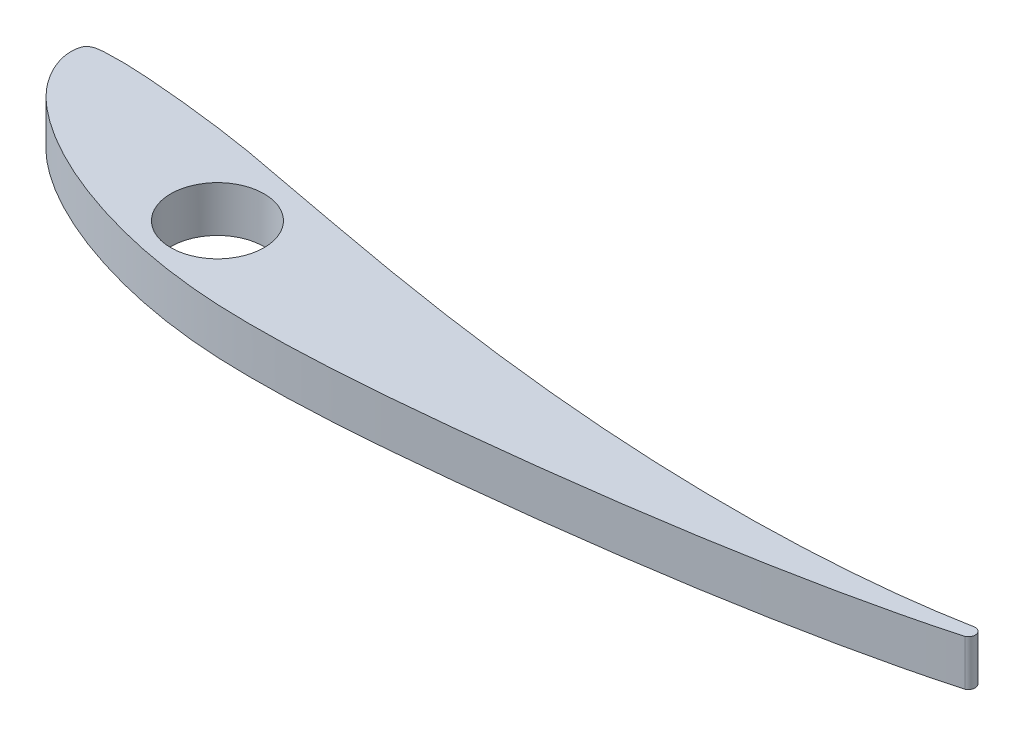
ISO-10303-21;
HEADER;
FILE_DESCRIPTION(('STEP AP214'),'2;1');
FILE_NAME('part.step','',(''),(''),'','','');
FILE_SCHEMA(('AUTOMOTIVE_DESIGN { 1 0 10303 214 1 1 1 1 }'));
ENDSEC;
DATA;
#1=APPLICATION_CONTEXT('core data for automotive mechanical design processes');
#2=APPLICATION_PROTOCOL_DEFINITION('international standard','automotive_design',2000,#1);
#3=PRODUCT_CONTEXT('',#1,'mechanical');
#4=PRODUCT('Part','Part','',(#3));
#5=PRODUCT_RELATED_PRODUCT_CATEGORY('part','',(#4));
#6=PRODUCT_DEFINITION_FORMATION('','',#4);
#7=PRODUCT_DEFINITION_CONTEXT('part definition',#1,'design');
#8=PRODUCT_DEFINITION('design','',#6,#7);
#9=PRODUCT_DEFINITION_SHAPE('','',#8);
#10=(LENGTH_UNIT() NAMED_UNIT(*) SI_UNIT(.MILLI.,.METRE.));
#11=(NAMED_UNIT(*) PLANE_ANGLE_UNIT() SI_UNIT($,.RADIAN.));
#12=(NAMED_UNIT(*) SI_UNIT($,.STERADIAN.) SOLID_ANGLE_UNIT());
#13=UNCERTAINTY_MEASURE_WITH_UNIT(LENGTH_MEASURE(1.E-05),#10,'distance_accuracy_value','');
#14=(GEOMETRIC_REPRESENTATION_CONTEXT(3) GLOBAL_UNCERTAINTY_ASSIGNED_CONTEXT((#13)) GLOBAL_UNIT_ASSIGNED_CONTEXT((#10,
#11,#12)) REPRESENTATION_CONTEXT('',''));
#15=CARTESIAN_POINT('',(0.,0.,0.));
#16=DIRECTION('',(0.,0.,1.));
#17=DIRECTION('',(1.,0.,0.));
#18=AXIS2_PLACEMENT_3D('',#15,#16,#17);
#19=CARTESIAN_POINT('',(150.,-3.175,0.));
#20=CARTESIAN_POINT('',(149.999082428381,-3.175,-0.00389582009736034));
#21=CARTESIAN_POINT('',(149.419672052869,-3.175,0.389722724012988));
#22=CARTESIAN_POINT('',(148.777054722267,-3.175,0.778630866538724));
#23=CARTESIAN_POINT('',(147.104253470449,-3.175,1.78360851317504));
#24=CARTESIAN_POINT('',(144.835255918469,-3.175,2.8706596932561));
#25=CARTESIAN_POINT('',(141.654931000593,-3.175,4.05876887414084));
#26=CARTESIAN_POINT('',(137.768772176686,-3.175,5.17228657159229));
#27=CARTESIAN_POINT('',(133.222466898318,-3.175,6.21322885215852));
#28=CARTESIAN_POINT('',(128.099790298759,-3.175,7.12992514558185));
#29=CARTESIAN_POINT('',(122.460796636297,-3.175,7.89171254868684));
#30=CARTESIAN_POINT('',(116.378899617892,-3.175,8.4765179201686));
#31=CARTESIAN_POINT('',(109.926502556761,-3.175,8.86194901902519));
#32=CARTESIAN_POINT('',(103.181194498135,-3.175,9.04303469629438));
#33=CARTESIAN_POINT('',(96.2202124792049,-3.175,9.01556347534483));
#34=CARTESIAN_POINT('',(89.1212177404967,-3.175,8.78153799605502));
#35=CARTESIAN_POINT('',(81.9612254877642,-3.175,8.35386710869585));
#36=CARTESIAN_POINT('',(74.8150435721909,-3.175,7.74954211330183));
#37=CARTESIAN_POINT('',(67.7543890329753,-3.175,6.98433613987588));
#38=CARTESIAN_POINT('',(60.8459682699353,-3.175,6.09268798297516));
#39=CARTESIAN_POINT('',(54.1519129709237,-3.175,5.10060814991434));
#40=CARTESIAN_POINT('',(47.7299218042865,-3.175,4.04455437653392));
#41=CARTESIAN_POINT('',(41.6298263636063,-3.175,2.95984773692774));
#42=CARTESIAN_POINT('',(35.8964372624995,-3.175,1.8872593890185));
#43=CARTESIAN_POINT('',(30.5657792465604,-3.175,0.871378580306832));
#44=CARTESIAN_POINT('',(25.6639152876827,-3.175,-0.0620603139216886));
#45=CARTESIAN_POINT('',(21.1663777493916,-3.175,-0.806236455276615));
#46=CARTESIAN_POINT('',(17.0512775954272,-3.175,-1.33837616882425));
#47=CARTESIAN_POINT('',(13.3205931283221,-3.175,-1.75315802660879));
#48=CARTESIAN_POINT('',(9.9925123734962,-3.175,-2.05951632249805));
#49=CARTESIAN_POINT('',(7.10109213474704,-3.175,-2.25049696083405));
#50=CARTESIAN_POINT('',(4.67850051945805,-3.175,-2.35412859107688));
#51=CARTESIAN_POINT('',(2.75214635583227,-3.175,-2.28571250716866));
#52=CARTESIAN_POINT('',(1.3439959058357,-3.175,-2.21532201430732));
#53=CARTESIAN_POINT('',(0.296818428144317,-3.175,-1.71669168240699));
#54=CARTESIAN_POINT('',(0.0154034725369719,-3.175,-0.712842884516727));
#55=CARTESIAN_POINT('',(-0.0320359192426204,-3.175,0.381585183657237));
#56=CARTESIAN_POINT('',(0.216127101284339,-3.175,1.67549317939556));
#57=CARTESIAN_POINT('',(0.736478585984824,-3.175,3.07725753828234));
#58=CARTESIAN_POINT('',(1.54814866536464,-3.175,4.55355888811399));
#59=CARTESIAN_POINT('',(2.6468022104134,-3.175,6.07094314969597));
#60=CARTESIAN_POINT('',(4.07694345004061,-3.175,7.58257399099648));
#61=CARTESIAN_POINT('',(5.83176589681352,-3.175,9.07535873582891));
#62=CARTESIAN_POINT('',(7.88583461059798,-3.175,10.565607603347));
#63=CARTESIAN_POINT('',(10.238291416027,-3.175,12.0217182709878));
#64=CARTESIAN_POINT('',(12.8743801617639,-3.175,13.423953281501));
#65=CARTESIAN_POINT('',(15.7797567934294,-3.175,14.7563611317161));
#66=CARTESIAN_POINT('',(18.9450960578764,-3.175,15.9918730111008));
#67=CARTESIAN_POINT('',(22.3507285308281,-3.175,17.1238704341557));
#68=CARTESIAN_POINT('',(25.9821629072986,-3.175,18.1258591702171));
#69=CARTESIAN_POINT('',(29.8240294835818,-3.175,18.9800756122586));
#70=CARTESIAN_POINT('',(33.8723652710562,-3.175,19.6390793339999));
#71=CARTESIAN_POINT('',(38.1281478975344,-3.175,20.1046513112587));
#72=CARTESIAN_POINT('',(42.6086861718545,-3.175,20.3335787752028));
#73=CARTESIAN_POINT('',(47.3157220885382,-3.175,20.3444131036094));
#74=CARTESIAN_POINT('',(52.2405056996449,-3.175,20.225708000823));
#75=CARTESIAN_POINT('',(57.35779940524,-3.175,19.952994498916));
#76=CARTESIAN_POINT('',(62.639144180053,-3.175,19.5572775987887));
#77=CARTESIAN_POINT('',(68.0543775168331,-3.175,19.0596198460294));
#78=CARTESIAN_POINT('',(73.5654214973001,-3.175,18.4879403081999));
#79=CARTESIAN_POINT('',(79.1273805633575,-3.175,17.8529185629785));
#80=CARTESIAN_POINT('',(84.6942136733634,-3.175,17.1705453823487));
#81=CARTESIAN_POINT('',(90.2214146874856,-3.175,16.4360180876635));
#82=CARTESIAN_POINT('',(95.6689490433948,-3.175,15.6516948201266));
#83=CARTESIAN_POINT('',(101.001904956754,-3.175,14.8237881075422));
#84=CARTESIAN_POINT('',(106.185791668959,-3.175,13.9506967600955));
#85=CARTESIAN_POINT('',(111.190736161851,-3.175,13.0436508102582));
#86=CARTESIAN_POINT('',(115.985219841489,-3.175,12.1039545564814));
#87=CARTESIAN_POINT('',(120.541223190119,-3.175,11.1431608499961));
#88=CARTESIAN_POINT('',(124.830924819146,-3.175,10.1662104195704));
#89=CARTESIAN_POINT('',(128.828757145348,-3.175,9.17920486900025));
#90=CARTESIAN_POINT('',(132.511800063579,-3.175,8.1892870115532));
#91=CARTESIAN_POINT('',(135.85971864832,-3.175,7.20554154204969));
#92=CARTESIAN_POINT('',(138.853765182208,-3.175,6.23258673383291));
#93=CARTESIAN_POINT('',(141.478397693167,-3.175,5.27886655467916));
#94=CARTESIAN_POINT('',(143.721372273851,-3.175,4.35111616153216));
#95=CARTESIAN_POINT('',(145.579273929924,-3.175,3.46224404255304));
#96=CARTESIAN_POINT('',(147.073285762808,-3.175,2.54518803079009));
#97=CARTESIAN_POINT('',(148.165385918256,-3.175,1.63564488717655));
#98=CARTESIAN_POINT('',(149.091049020767,-3.175,0.780692200443918));
#99=CARTESIAN_POINT('',(149.507930169283,-3.175,0.371377778407435));
#100=CARTESIAN_POINT('',(150.000899289152,-3.175,0.00381819650754722));
#101=CARTESIAN_POINT('',(150.,-3.175,0.));
#102=B_SPLINE_CURVE_WITH_KNOTS('',3,(#19,#20,#21,#22,#23,#24,#25,#26,#27,#28,#29,#30,#31,#32,
#33,#34,#35,#36,#37,#38,#39,#40,#41,#42,#43,#44,#45,#46,#47,#48,#49,#50,#51,#52,#53,#54,#55,#56,
#57,#58,#59,#60,#61,#62,#63,#64,#65,#66,#67,#68,#69,#70,#71,#72,#73,#74,#75,#76,#77,#78,#79,#80,
#81,#82,#83,#84,#85,#86,#87,#88,#89,#90,#91,#92,#93,#94,#95,#96,#97,#98,#99,#100,#101),
.UNSPECIFIED.,.T.,.F.,(4,1,1,1,1,1,1,1,1,1,1,1,1,1,1,1,1,1,1,1,1,1,1,1,1,1,1,1,1,1,1,1,1,1,1,1,
1,1,1,1,1,1,1,1,1,1,1,1,1,1,1,1,1,1,1,1,1,1,1,1,1,1,1,1,1,1,1,1,1,1,1,1,1,1,1,1,1,1,1,1,4),(0.,
0.000999594313299323,0.00414743475003776,0.00974820897402395,0.0180443769200241,
0.0288641783652488,0.0418307896412056,0.056713806957678,0.0733412324180671,0.0915079886594421,
0.111021837040934,0.131661709492213,0.153207715119588,0.175433402170293,0.198110317315045,
0.221011446315139,0.243905882495844,0.266573311035611,0.288810349135398,0.310405035997316,
0.331177743204304,0.350943876391454,0.369556399670184,0.386864963345299,0.402753039208367,
0.417195875784384,0.430379518903367,0.44236263317429,0.453032155511854,0.462284345612073,
0.470026206002306,0.476176644820514,0.4806499474091,0.483553073373249,0.486420689318958,
0.489953231463337,0.49409692674396,0.498850588304448,0.504196750280793,0.510125492183598,
0.516691031253851,0.524011699263473,0.532092122465354,0.540897920896839,0.550403413935838,
0.560581040891741,0.571396483088815,0.582828080950065,0.594829641292505,0.607347037120814,
0.620384325080165,0.633968936607919,0.648199967415963,0.663193936825189,0.678898580785939,
0.695226562400326,0.712113220733956,0.729459406270428,0.747143116877991,0.765009771536014,
0.782904928287736,0.800688045055655,0.818242104849469,0.835449083117584,0.852211620697039,
0.868429578359411,0.884009362888173,0.898854951230209,0.912881826809319,0.926010749515415,
0.938166770937821,0.949289699209522,0.959322171916738,0.968216949447241,0.975948220006129,
0.982474409223121,0.987904722814407,0.992516501480522,0.996351137832237,0.999020322442866,1.),.UNSPECIFIED.);
#103=DIRECTION('',(0.,1.,0.));
#104=VECTOR('',#103,1.);
#105=SURFACE_OF_LINEAR_EXTRUSION('',#102,#104);
#106=DIRECTION('',(0.,1.,0.));
#107=VECTOR('',#106,1.);
#108=CARTESIAN_POINT('',(132.233952939201,-3.175,8.25240600832476));
#109=LINE('',#108,#107);
#110=CARTESIAN_POINT('',(132.233952939201,-3.175,8.25240600832476));
#111=VERTEX_POINT('',#110);
#112=CARTESIAN_POINT('',(132.233952939201,3.175,8.25240600832476));
#113=VERTEX_POINT('',#112);
#114=EDGE_CURVE('E74',#111,#113,#109,.T.);
#115=ORIENTED_EDGE('',*,*,#114,.T.);
#116=CARTESIAN_POINT('',(150.,3.175,0.));
#117=CARTESIAN_POINT('',(149.999082428381,3.175,-0.00389582009736034));
#118=CARTESIAN_POINT('',(149.419672052869,3.175,0.389722724012988));
#119=CARTESIAN_POINT('',(148.777054722267,3.175,0.778630866538724));
#120=CARTESIAN_POINT('',(147.104253470449,3.175,1.78360851317504));
#121=CARTESIAN_POINT('',(144.835255918469,3.175,2.8706596932561));
#122=CARTESIAN_POINT('',(141.654931000593,3.175,4.05876887414084));
#123=CARTESIAN_POINT('',(137.768772176686,3.175,5.17228657159229));
#124=CARTESIAN_POINT('',(133.222466898318,3.175,6.21322885215852));
#125=CARTESIAN_POINT('',(128.099790298759,3.175,7.12992514558185));
#126=CARTESIAN_POINT('',(122.460796636297,3.175,7.89171254868684));
#127=CARTESIAN_POINT('',(116.378899617892,3.175,8.4765179201686));
#128=CARTESIAN_POINT('',(109.926502556761,3.175,8.86194901902519));
#129=CARTESIAN_POINT('',(103.181194498135,3.175,9.04303469629438));
#130=CARTESIAN_POINT('',(96.2202124792049,3.175,9.01556347534483));
#131=CARTESIAN_POINT('',(89.1212177404967,3.175,8.78153799605502));
#132=CARTESIAN_POINT('',(81.9612254877642,3.175,8.35386710869585));
#133=CARTESIAN_POINT('',(74.8150435721909,3.175,7.74954211330183));
#134=CARTESIAN_POINT('',(67.7543890329753,3.175,6.98433613987588));
#135=CARTESIAN_POINT('',(60.8459682699353,3.175,6.09268798297516));
#136=CARTESIAN_POINT('',(54.1519129709237,3.175,5.10060814991434));
#137=CARTESIAN_POINT('',(47.7299218042865,3.175,4.04455437653392));
#138=CARTESIAN_POINT('',(41.6298263636063,3.175,2.95984773692774));
#139=CARTESIAN_POINT('',(35.8964372624995,3.175,1.8872593890185));
#140=CARTESIAN_POINT('',(30.5657792465604,3.175,0.871378580306832));
#141=CARTESIAN_POINT('',(25.6639152876827,3.175,-0.0620603139216886));
#142=CARTESIAN_POINT('',(21.1663777493916,3.175,-0.806236455276615));
#143=CARTESIAN_POINT('',(17.0512775954272,3.175,-1.33837616882425));
#144=CARTESIAN_POINT('',(13.3205931283221,3.175,-1.75315802660879));
#145=CARTESIAN_POINT('',(9.9925123734962,3.175,-2.05951632249805));
#146=CARTESIAN_POINT('',(7.10109213474704,3.175,-2.25049696083405));
#147=CARTESIAN_POINT('',(4.67850051945805,3.175,-2.35412859107688));
#148=CARTESIAN_POINT('',(2.75214635583227,3.175,-2.28571250716866));
#149=CARTESIAN_POINT('',(1.3439959058357,3.175,-2.21532201430732));
#150=CARTESIAN_POINT('',(0.296818428144317,3.175,-1.71669168240699));
#151=CARTESIAN_POINT('',(0.0154034725369719,3.175,-0.712842884516727));
#152=CARTESIAN_POINT('',(-0.0320359192426204,3.175,0.381585183657237));
#153=CARTESIAN_POINT('',(0.216127101284339,3.175,1.67549317939556));
#154=CARTESIAN_POINT('',(0.736478585984824,3.175,3.07725753828234));
#155=CARTESIAN_POINT('',(1.54814866536464,3.175,4.55355888811399));
#156=CARTESIAN_POINT('',(2.6468022104134,3.175,6.07094314969597));
#157=CARTESIAN_POINT('',(4.07694345004061,3.175,7.58257399099648));
#158=CARTESIAN_POINT('',(5.83176589681352,3.175,9.07535873582891));
#159=CARTESIAN_POINT('',(7.88583461059798,3.175,10.565607603347));
#160=CARTESIAN_POINT('',(10.238291416027,3.175,12.0217182709878));
#161=CARTESIAN_POINT('',(12.8743801617639,3.175,13.423953281501));
#162=CARTESIAN_POINT('',(15.7797567934294,3.175,14.7563611317161));
#163=CARTESIAN_POINT('',(18.9450960578764,3.175,15.9918730111008));
#164=CARTESIAN_POINT('',(22.3507285308281,3.175,17.1238704341557));
#165=CARTESIAN_POINT('',(25.9821629072986,3.175,18.1258591702171));
#166=CARTESIAN_POINT('',(29.8240294835818,3.175,18.9800756122586));
#167=CARTESIAN_POINT('',(33.8723652710562,3.175,19.6390793339999));
#168=CARTESIAN_POINT('',(38.1281478975344,3.175,20.1046513112587));
#169=CARTESIAN_POINT('',(42.6086861718545,3.175,20.3335787752028));
#170=CARTESIAN_POINT('',(47.3157220885382,3.175,20.3444131036094));
#171=CARTESIAN_POINT('',(52.2405056996449,3.175,20.225708000823));
#172=CARTESIAN_POINT('',(57.35779940524,3.175,19.952994498916));
#173=CARTESIAN_POINT('',(62.639144180053,3.175,19.5572775987887));
#174=CARTESIAN_POINT('',(68.0543775168331,3.175,19.0596198460294));
#175=CARTESIAN_POINT('',(73.5654214973001,3.175,18.4879403081999));
#176=CARTESIAN_POINT('',(79.1273805633575,3.175,17.8529185629785));
#177=CARTESIAN_POINT('',(84.6942136733634,3.175,17.1705453823487));
#178=CARTESIAN_POINT('',(90.2214146874856,3.175,16.4360180876635));
#179=CARTESIAN_POINT('',(95.6689490433948,3.175,15.6516948201266));
#180=CARTESIAN_POINT('',(101.001904956754,3.175,14.8237881075422));
#181=CARTESIAN_POINT('',(106.185791668959,3.175,13.9506967600955));
#182=CARTESIAN_POINT('',(111.190736161851,3.175,13.0436508102582));
#183=CARTESIAN_POINT('',(115.985219841489,3.175,12.1039545564814));
#184=CARTESIAN_POINT('',(120.541223190119,3.175,11.1431608499961));
#185=CARTESIAN_POINT('',(124.830924819146,3.175,10.1662104195704));
#186=CARTESIAN_POINT('',(128.828757145348,3.175,9.17920486900025));
#187=CARTESIAN_POINT('',(132.511800063579,3.175,8.1892870115532));
#188=CARTESIAN_POINT('',(135.85971864832,3.175,7.20554154204969));
#189=CARTESIAN_POINT('',(138.853765182208,3.175,6.23258673383291));
#190=CARTESIAN_POINT('',(141.478397693167,3.175,5.27886655467916));
#191=CARTESIAN_POINT('',(143.721372273851,3.175,4.35111616153216));
#192=CARTESIAN_POINT('',(145.579273929924,3.175,3.46224404255304));
#193=CARTESIAN_POINT('',(147.073285762808,3.175,2.54518803079009));
#194=CARTESIAN_POINT('',(148.165385918256,3.175,1.63564488717655));
#195=CARTESIAN_POINT('',(149.091049020767,3.175,0.780692200443918));
#196=CARTESIAN_POINT('',(149.507930169283,3.175,0.371377778407435));
#197=CARTESIAN_POINT('',(150.000899289152,3.175,0.00381819650754722));
#198=CARTESIAN_POINT('',(150.,3.175,0.));
#199=B_SPLINE_CURVE_WITH_KNOTS('',3,(#116,#117,#118,#119,#120,#121,#122,#123,#124,#125,#126,
#127,#128,#129,#130,#131,#132,#133,#134,#135,#136,#137,#138,#139,#140,#141,#142,#143,#144,#145,
#146,#147,#148,#149,#150,#151,#152,#153,#154,#155,#156,#157,#158,#159,#160,#161,#162,#163,#164,
#165,#166,#167,#168,#169,#170,#171,#172,#173,#174,#175,#176,#177,#178,#179,#180,#181,#182,#183,
#184,#185,#186,#187,#188,#189,#190,#191,#192,#193,#194,#195,#196,#197,#198),.UNSPECIFIED.,.T.,
.F.,(4,1,1,1,1,1,1,1,1,1,1,1,1,1,1,1,1,1,1,1,1,1,1,1,1,1,1,1,1,1,1,1,1,1,1,1,1,1,1,1,1,1,1,1,1,
1,1,1,1,1,1,1,1,1,1,1,1,1,1,1,1,1,1,1,1,1,1,1,1,1,1,1,1,1,1,1,1,1,1,1,4),(0.,
0.000999594313299323,0.00414743475003776,0.00974820897402395,0.0180443769200241,
0.0288641783652488,0.0418307896412056,0.056713806957678,0.0733412324180671,0.0915079886594421,
0.111021837040934,0.131661709492213,0.153207715119588,0.175433402170293,0.198110317315045,
0.221011446315139,0.243905882495844,0.266573311035611,0.288810349135398,0.310405035997316,
0.331177743204304,0.350943876391454,0.369556399670184,0.386864963345299,0.402753039208367,
0.417195875784384,0.430379518903367,0.44236263317429,0.453032155511854,0.462284345612073,
0.470026206002306,0.476176644820514,0.4806499474091,0.483553073373249,0.486420689318958,
0.489953231463337,0.49409692674396,0.498850588304448,0.504196750280793,0.510125492183598,
0.516691031253851,0.524011699263473,0.532092122465354,0.540897920896839,0.550403413935838,
0.560581040891741,0.571396483088815,0.582828080950065,0.594829641292505,0.607347037120814,
0.620384325080165,0.633968936607919,0.648199967415963,0.663193936825189,0.678898580785939,
0.695226562400326,0.712113220733956,0.729459406270428,0.747143116877991,0.765009771536014,
0.782904928287736,0.800688045055655,0.818242104849469,0.835449083117584,0.852211620697039,
0.868429578359411,0.884009362888173,0.898854951230209,0.912881826809319,0.926010749515415,
0.938166770937821,0.949289699209522,0.959322171916738,0.968216949447241,0.975948220006129,
0.982474409223121,0.987904722814407,0.992516501480522,0.996351137832237,0.999020322442866,1.),.UNSPECIFIED.);
#200=CARTESIAN_POINT('',(131.891825994183,3.175,6.43458817714213));
#201=VERTEX_POINT('',#200);
#202=EDGE_CURVE('E67',#201,#113,#199,.T.);
#203=ORIENTED_EDGE('',*,*,#202,.F.);
#204=DIRECTION('',(0.,1.,0.));
#205=VECTOR('',#204,1.);
#206=CARTESIAN_POINT('',(131.891825994183,-3.175,6.43458817714213));
#207=LINE('',#206,#205);
#208=CARTESIAN_POINT('',(131.891825994183,-3.175,6.43458817714135));
#209=VERTEX_POINT('',#208);
#210=EDGE_CURVE('E55',#209,#201,#207,.T.);
#211=ORIENTED_EDGE('',*,*,#210,.F.);
#212=EDGE_CURVE('E48',#209,#111,#102,.T.);
#213=ORIENTED_EDGE('',*,*,#212,.T.);
#214=EDGE_LOOP('',(#115,#203,#211,#213));
#215=FACE_BOUND('',#214,.T.);
#216=ADVANCED_FACE('F39',(#215),#105,.T.);
#217=CARTESIAN_POINT('',(0.900676601870592,-3.175,3.33146790704024));
#218=DIRECTION('',(0.,-1.,0.));
#219=DIRECTION('',(0.,0.,-1.));
#220=AXIS2_PLACEMENT_3D('',#217,#218,#219);
#221=PLANE('',#220);
#222=CARTESIAN_POINT('',(131.851798108847,-3.175,7.38322606894853));
#223=DIRECTION('',(0.,-1.,0.));
#224=DIRECTION('',(0.,0.,-1.));
#225=AXIS2_PLACEMENT_3D('',#222,#223,#224);
#226=CIRCLE('',#225,0.949482006873653);
#227=EDGE_CURVE('E59',#209,#111,#226,.T.);
#228=ORIENTED_EDGE('',*,*,#227,.T.);
#229=ORIENTED_EDGE('',*,*,#212,.F.);
#230=EDGE_LOOP('',(#228,#229));
#231=FACE_BOUND('',#230,.T.);
#232=CARTESIAN_POINT('',(30.48,-3.175,10.16));
#233=DIRECTION('',(0.,1.,0.));
#234=DIRECTION('',(0.,0.,1.));
#235=AXIS2_PLACEMENT_3D('',#232,#233,#234);
#236=CIRCLE('',#235,6.47699999999999);
#237=CARTESIAN_POINT('',(30.48,-3.175,16.637));
#238=VERTEX_POINT('',#237);
#239=EDGE_CURVE('E77',#238,#238,#236,.T.);
#240=ORIENTED_EDGE('',*,*,#239,.T.);
#241=EDGE_LOOP('',(#240));
#242=FACE_BOUND('',#241,.T.);
#243=ADVANCED_FACE('F109',(#231,#242),#221,.T.);
#244=CARTESIAN_POINT('',(0.900676601870592,3.175,3.33146790704024));
#245=DIRECTION('',(0.,-1.,0.));
#246=DIRECTION('',(0.,0.,-1.));
#247=AXIS2_PLACEMENT_3D('',#244,#245,#246);
#248=PLANE('',#247);
#249=CARTESIAN_POINT('',(30.48,3.175,10.16));
#250=DIRECTION('',(0.,-1.,0.));
#251=DIRECTION('',(0.,0.,-1.));
#252=AXIS2_PLACEMENT_3D('',#249,#250,#251);
#253=CIRCLE('',#252,6.47699999999999);
#254=CARTESIAN_POINT('',(30.48,3.175,3.68300000000001));
#255=VERTEX_POINT('',#254);
#256=EDGE_CURVE('E71',#255,#255,#253,.T.);
#257=ORIENTED_EDGE('',*,*,#256,.T.);
#258=EDGE_LOOP('',(#257));
#259=FACE_BOUND('',#258,.T.);
#260=ORIENTED_EDGE('',*,*,#202,.T.);
#261=CARTESIAN_POINT('',(131.851798108847,3.175,7.38322606894853));
#262=DIRECTION('',(0.,-1.,0.));
#263=DIRECTION('',(0.,0.,-1.));
#264=AXIS2_PLACEMENT_3D('',#261,#262,#263);
#265=CIRCLE('',#264,0.949482006873653);
#266=EDGE_CURVE('E11',#113,#201,#265,.F.);
#267=ORIENTED_EDGE('',*,*,#266,.T.);
#268=EDGE_LOOP('',(#260,#267));
#269=FACE_BOUND('',#268,.T.);
#270=ADVANCED_FACE('F68',(#259,#269),#248,.F.);
#271=CARTESIAN_POINT('',(30.48,-3.175,10.16));
#272=DIRECTION('',(0.,1.,0.));
#273=DIRECTION('',(0.,0.,1.));
#274=AXIS2_PLACEMENT_3D('',#271,#272,#273);
#275=CYLINDRICAL_SURFACE('',#274,6.47699999999999);
#276=ORIENTED_EDGE('',*,*,#239,.F.);
#277=EDGE_LOOP('',(#276));
#278=FACE_BOUND('',#277,.T.);
#279=ORIENTED_EDGE('',*,*,#256,.F.);
#280=EDGE_LOOP('',(#279));
#281=FACE_BOUND('',#280,.T.);
#282=ADVANCED_FACE('F99',(#278,#281),#275,.F.);
#283=CARTESIAN_POINT('',(131.851798108847,-3.175,7.38322606894853));
#284=DIRECTION('',(0.,1.,0.));
#285=DIRECTION('',(0.,0.,1.));
#286=AXIS2_PLACEMENT_3D('',#283,#284,#285);
#287=CYLINDRICAL_SURFACE('',#286,0.949482006873653);
#288=ORIENTED_EDGE('',*,*,#210,.T.);
#289=ORIENTED_EDGE('',*,*,#266,.F.);
#290=ORIENTED_EDGE('',*,*,#114,.F.);
#291=ORIENTED_EDGE('',*,*,#227,.F.);
#292=EDGE_LOOP('',(#288,#289,#290,#291));
#293=FACE_BOUND('',#292,.T.);
#294=ADVANCED_FACE('F73',(#293),#287,.T.);
#295=CLOSED_SHELL('',(#216,#243,#270,#282,#294));
#296=MANIFOLD_SOLID_BREP('B2',#295);
#297=ADVANCED_BREP_SHAPE_REPRESENTATION('',(#18,#296),#14);
#298=SHAPE_DEFINITION_REPRESENTATION(#9,#297);
ENDSEC;
END-ISO-10303-21;
